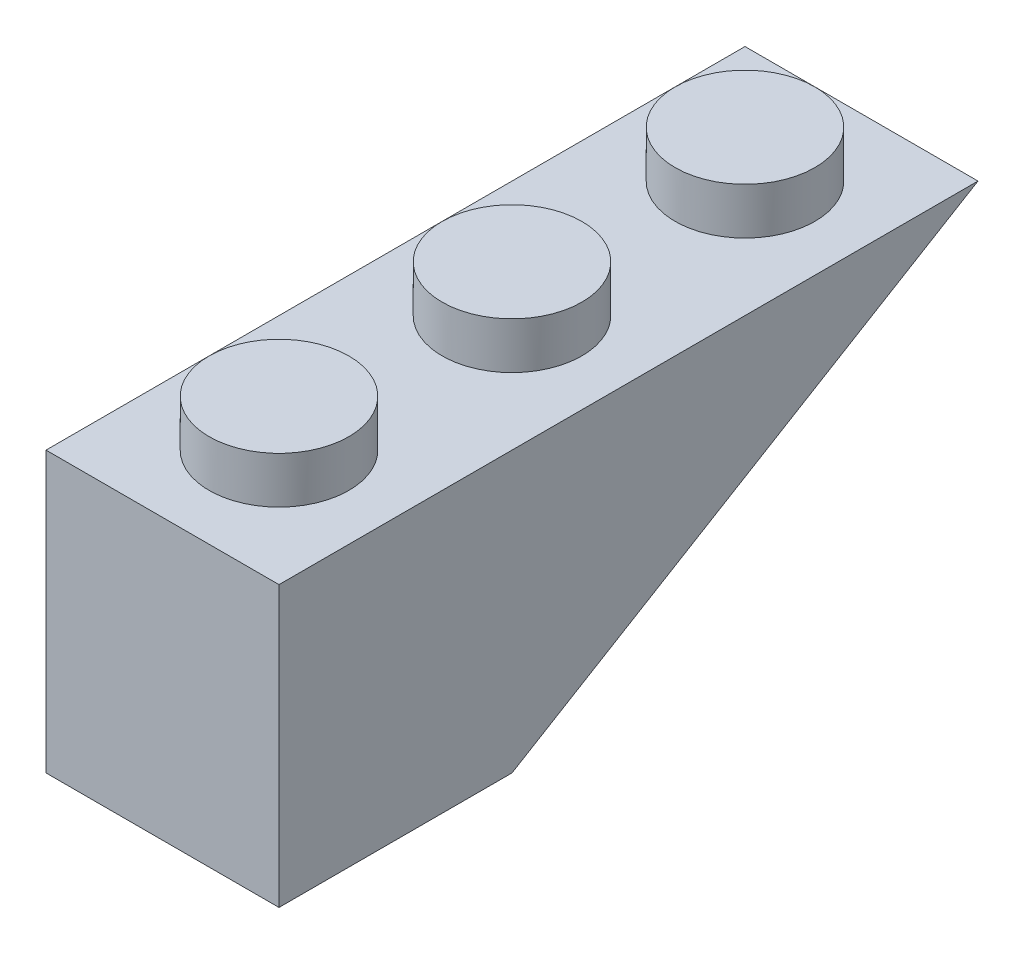
ISO-10303-21;
HEADER;
FILE_DESCRIPTION(('STEP AP214'),'2;1');
FILE_NAME('part.step','',(''),(''),'','','');
FILE_SCHEMA(('AUTOMOTIVE_DESIGN { 1 0 10303 214 1 1 1 1 }'));
ENDSEC;
DATA;
#1=APPLICATION_CONTEXT('core data for automotive mechanical design processes');
#2=APPLICATION_PROTOCOL_DEFINITION('international standard','automotive_design',2000,#1);
#3=PRODUCT_CONTEXT('',#1,'mechanical');
#4=PRODUCT('Part','Part','',(#3));
#5=PRODUCT_RELATED_PRODUCT_CATEGORY('part','',(#4));
#6=PRODUCT_DEFINITION_FORMATION('','',#4);
#7=PRODUCT_DEFINITION_CONTEXT('part definition',#1,'design');
#8=PRODUCT_DEFINITION('design','',#6,#7);
#9=PRODUCT_DEFINITION_SHAPE('','',#8);
#10=(LENGTH_UNIT() NAMED_UNIT(*) SI_UNIT(.MILLI.,.METRE.));
#11=(NAMED_UNIT(*) PLANE_ANGLE_UNIT() SI_UNIT($,.RADIAN.));
#12=(NAMED_UNIT(*) SI_UNIT($,.STERADIAN.) SOLID_ANGLE_UNIT());
#13=UNCERTAINTY_MEASURE_WITH_UNIT(LENGTH_MEASURE(1.E-05),#10,'distance_accuracy_value','');
#14=(GEOMETRIC_REPRESENTATION_CONTEXT(3) GLOBAL_UNCERTAINTY_ASSIGNED_CONTEXT((#13)) GLOBAL_UNIT_ASSIGNED_CONTEXT((#10,
#11,#12)) REPRESENTATION_CONTEXT('',''));
#15=CARTESIAN_POINT('',(0.,0.,0.));
#16=DIRECTION('',(0.,0.,1.));
#17=DIRECTION('',(1.,0.,0.));
#18=AXIS2_PLACEMENT_3D('',#15,#16,#17);
#19=CARTESIAN_POINT('',(8.,0.,0.));
#20=DIRECTION('',(0.,1.,0.));
#21=DIRECTION('',(0.,0.,1.));
#22=AXIS2_PLACEMENT_3D('',#19,#20,#21);
#23=PLANE('',#22);
#24=DIRECTION('',(0.,0.,-1.));
#25=VECTOR('',#24,1.);
#26=CARTESIAN_POINT('',(0.,0.,0.));
#27=LINE('',#26,#25);
#28=CARTESIAN_POINT('',(0.,0.,0.));
#29=VERTEX_POINT('',#28);
#30=CARTESIAN_POINT('',(0.,0.,-8.));
#31=VERTEX_POINT('',#30);
#32=EDGE_CURVE('E187',#29,#31,#27,.T.);
#33=ORIENTED_EDGE('',*,*,#32,.T.);
#34=DIRECTION('',(-1.,0.,0.));
#35=VECTOR('',#34,1.);
#36=CARTESIAN_POINT('',(8.,0.,-8.));
#37=LINE('',#36,#35);
#38=CARTESIAN_POINT('',(8.,0.,-8.));
#39=VERTEX_POINT('',#38);
#40=EDGE_CURVE('E194',#39,#31,#37,.T.);
#41=ORIENTED_EDGE('',*,*,#40,.F.);
#42=DIRECTION('',(0.,0.,-1.));
#43=VECTOR('',#42,1.);
#44=CARTESIAN_POINT('',(8.,0.,0.));
#45=LINE('',#44,#43);
#46=CARTESIAN_POINT('',(8.,0.,0.));
#47=VERTEX_POINT('',#46);
#48=EDGE_CURVE('E89',#47,#39,#45,.T.);
#49=ORIENTED_EDGE('',*,*,#48,.F.);
#50=DIRECTION('',(-1.,0.,0.));
#51=VECTOR('',#50,1.);
#52=CARTESIAN_POINT('',(8.,0.,0.));
#53=LINE('',#52,#51);
#54=EDGE_CURVE('E197',#47,#29,#53,.T.);
#55=ORIENTED_EDGE('',*,*,#54,.T.);
#56=EDGE_LOOP('',(#33,#41,#49,#55));
#57=FACE_BOUND('',#56,.T.);
#58=DIRECTION('',(0.,0.,-1.));
#59=VECTOR('',#58,1.);
#60=CARTESIAN_POINT('',(1.6,0.,0.));
#61=LINE('',#60,#59);
#62=CARTESIAN_POINT('',(1.6,0.,-1.6));
#63=VERTEX_POINT('',#62);
#64=CARTESIAN_POINT('',(1.6,0.,-6.4));
#65=VERTEX_POINT('',#64);
#66=EDGE_CURVE('E139',#63,#65,#61,.T.);
#67=ORIENTED_EDGE('',*,*,#66,.F.);
#68=DIRECTION('',(-1.,0.,0.));
#69=VECTOR('',#68,1.);
#70=CARTESIAN_POINT('',(8.,0.,-1.6));
#71=LINE('',#70,#69);
#72=CARTESIAN_POINT('',(6.4,0.,-1.6));
#73=VERTEX_POINT('',#72);
#74=EDGE_CURVE('E167',#73,#63,#71,.T.);
#75=ORIENTED_EDGE('',*,*,#74,.F.);
#76=DIRECTION('',(0.,0.,-1.));
#77=VECTOR('',#76,1.);
#78=CARTESIAN_POINT('',(6.4,0.,0.));
#79=LINE('',#78,#77);
#80=CARTESIAN_POINT('',(6.4,0.,-6.4));
#81=VERTEX_POINT('',#80);
#82=EDGE_CURVE('E145',#73,#81,#79,.T.);
#83=ORIENTED_EDGE('',*,*,#82,.T.);
#84=DIRECTION('',(-1.,0.,0.));
#85=VECTOR('',#84,1.);
#86=CARTESIAN_POINT('',(8.,0.,-6.4));
#87=LINE('',#86,#85);
#88=EDGE_CURVE('E162',#81,#65,#87,.T.);
#89=ORIENTED_EDGE('',*,*,#88,.T.);
#90=EDGE_LOOP('',(#67,#75,#83,#89));
#91=FACE_BOUND('',#90,.T.);
#92=ADVANCED_FACE('F43',(#57,#91),#23,.F.);
#93=CARTESIAN_POINT('',(8.,9.6,0.));
#94=DIRECTION('',(0.,0.,-1.));
#95=DIRECTION('',(0.,1.,0.));
#96=AXIS2_PLACEMENT_3D('',#93,#94,#95);
#97=PLANE('',#96);
#98=DIRECTION('',(0.,-1.,0.));
#99=VECTOR('',#98,1.);
#100=CARTESIAN_POINT('',(0.,9.6,0.));
#101=LINE('',#100,#99);
#102=CARTESIAN_POINT('',(0.,9.6,0.));
#103=VERTEX_POINT('',#102);
#104=EDGE_CURVE('E170',#103,#29,#101,.T.);
#105=ORIENTED_EDGE('',*,*,#104,.T.);
#106=ORIENTED_EDGE('',*,*,#54,.F.);
#107=DIRECTION('',(0.,-1.,0.));
#108=VECTOR('',#107,1.);
#109=CARTESIAN_POINT('',(8.,9.6,0.));
#110=LINE('',#109,#108);
#111=CARTESIAN_POINT('',(8.,9.6,0.));
#112=VERTEX_POINT('',#111);
#113=EDGE_CURVE('E179',#112,#47,#110,.T.);
#114=ORIENTED_EDGE('',*,*,#113,.F.);
#115=DIRECTION('',(-1.,0.,0.));
#116=VECTOR('',#115,1.);
#117=CARTESIAN_POINT('',(8.,9.6,0.));
#118=LINE('',#117,#116);
#119=EDGE_CURVE('E119',#112,#103,#118,.T.);
#120=ORIENTED_EDGE('',*,*,#119,.T.);
#121=EDGE_LOOP('',(#105,#106,#114,#120));
#122=FACE_BOUND('',#121,.T.);
#123=ADVANCED_FACE('F45',(#122),#97,.F.);
#124=CARTESIAN_POINT('',(8.,9.6,0.));
#125=DIRECTION('',(0.,-1.,0.));
#126=DIRECTION('',(0.,0.,-1.));
#127=AXIS2_PLACEMENT_3D('',#124,#125,#126);
#128=PLANE('',#127);
#129=CARTESIAN_POINT('',(4.,9.6,-20.));
#130=DIRECTION('',(0.,-1.,0.));
#131=DIRECTION('',(0.,0.,-1.));
#132=AXIS2_PLACEMENT_3D('',#129,#130,#131);
#133=CIRCLE('',#132,2.4);
#134=CARTESIAN_POINT('',(4.,9.6,-22.4));
#135=VERTEX_POINT('',#134);
#136=EDGE_CURVE('E11',#135,#135,#133,.F.);
#137=ORIENTED_EDGE('',*,*,#136,.F.);
#138=EDGE_LOOP('',(#137));
#139=FACE_BOUND('',#138,.T.);
#140=CARTESIAN_POINT('',(4.,9.6,-12.));
#141=DIRECTION('',(0.,-1.,0.));
#142=DIRECTION('',(0.,0.,-1.));
#143=AXIS2_PLACEMENT_3D('',#140,#141,#142);
#144=CIRCLE('',#143,2.4);
#145=CARTESIAN_POINT('',(4.,9.6,-14.4));
#146=VERTEX_POINT('',#145);
#147=EDGE_CURVE('E52',#146,#146,#144,.F.);
#148=ORIENTED_EDGE('',*,*,#147,.F.);
#149=EDGE_LOOP('',(#148));
#150=FACE_BOUND('',#149,.T.);
#151=CARTESIAN_POINT('',(4.,9.6,-4.));
#152=DIRECTION('',(0.,-1.,0.));
#153=DIRECTION('',(0.,0.,-1.));
#154=AXIS2_PLACEMENT_3D('',#151,#152,#153);
#155=CIRCLE('',#154,2.4);
#156=CARTESIAN_POINT('',(4.,9.6,-6.4));
#157=VERTEX_POINT('',#156);
#158=EDGE_CURVE('E200',#157,#157,#155,.F.);
#159=ORIENTED_EDGE('',*,*,#158,.F.);
#160=EDGE_LOOP('',(#159));
#161=FACE_BOUND('',#160,.T.);
#162=DIRECTION('',(0.,0.,1.));
#163=VECTOR('',#162,1.);
#164=CARTESIAN_POINT('',(0.,9.6,0.));
#165=LINE('',#164,#163);
#166=CARTESIAN_POINT('',(0.,9.6,-24.));
#167=VERTEX_POINT('',#166);
#168=EDGE_CURVE('E83',#167,#103,#165,.T.);
#169=ORIENTED_EDGE('',*,*,#168,.T.);
#170=ORIENTED_EDGE('',*,*,#119,.F.);
#171=DIRECTION('',(0.,0.,1.));
#172=VECTOR('',#171,1.);
#173=CARTESIAN_POINT('',(8.,9.6,0.));
#174=LINE('',#173,#172);
#175=CARTESIAN_POINT('',(8.,9.6,-24.));
#176=VERTEX_POINT('',#175);
#177=EDGE_CURVE('E68',#176,#112,#174,.T.);
#178=ORIENTED_EDGE('',*,*,#177,.F.);
#179=DIRECTION('',(-1.,0.,0.));
#180=VECTOR('',#179,1.);
#181=CARTESIAN_POINT('',(8.,9.6,-24.));
#182=LINE('',#181,#180);
#183=EDGE_CURVE('E118',#176,#167,#182,.T.);
#184=ORIENTED_EDGE('',*,*,#183,.T.);
#185=EDGE_LOOP('',(#169,#170,#178,#184));
#186=FACE_BOUND('',#185,.T.);
#187=ADVANCED_FACE('F116',(#139,#150,#161,#186),#128,.F.);
#188=CARTESIAN_POINT('',(8.,0.,0.));
#189=DIRECTION('',(1.,0.,0.));
#190=DIRECTION('',(0.,0.,-1.));
#191=AXIS2_PLACEMENT_3D('',#188,#189,#190);
#192=PLANE('',#191);
#193=ORIENTED_EDGE('',*,*,#113,.T.);
#194=ORIENTED_EDGE('',*,*,#48,.T.);
#195=DIRECTION('',(0.,0.514495755427527,-0.857492925712544));
#196=VECTOR('',#195,1.);
#197=CARTESIAN_POINT('',(8.,0.,-8.));
#198=LINE('',#197,#196);
#199=EDGE_CURVE('E124',#39,#176,#198,.T.);
#200=ORIENTED_EDGE('',*,*,#199,.T.);
#201=ORIENTED_EDGE('',*,*,#177,.T.);
#202=EDGE_LOOP('',(#193,#194,#200,#201));
#203=FACE_BOUND('',#202,.T.);
#204=ADVANCED_FACE('F125',(#203),#192,.T.);
#205=CARTESIAN_POINT('',(0.,0.,0.));
#206=DIRECTION('',(1.,0.,0.));
#207=DIRECTION('',(0.,0.,-1.));
#208=AXIS2_PLACEMENT_3D('',#205,#206,#207);
#209=PLANE('',#208);
#210=ORIENTED_EDGE('',*,*,#104,.F.);
#211=ORIENTED_EDGE('',*,*,#168,.F.);
#212=DIRECTION('',(0.,0.514495755427527,-0.857492925712544));
#213=VECTOR('',#212,1.);
#214=CARTESIAN_POINT('',(0.,0.,-8.));
#215=LINE('',#214,#213);
#216=EDGE_CURVE('E129',#31,#167,#215,.T.);
#217=ORIENTED_EDGE('',*,*,#216,.F.);
#218=ORIENTED_EDGE('',*,*,#32,.F.);
#219=EDGE_LOOP('',(#210,#211,#217,#218));
#220=FACE_BOUND('',#219,.T.);
#221=ADVANCED_FACE('F236',(#220),#209,.F.);
#222=CARTESIAN_POINT('',(8.,9.6,-1.6));
#223=DIRECTION('',(0.,0.,-1.));
#224=DIRECTION('',(0.,1.,0.));
#225=AXIS2_PLACEMENT_3D('',#222,#223,#224);
#226=PLANE('',#225);
#227=DIRECTION('',(0.,-1.,0.));
#228=VECTOR('',#227,1.);
#229=CARTESIAN_POINT('',(1.6,9.6,-1.6));
#230=LINE('',#229,#228);
#231=CARTESIAN_POINT('',(1.6,8.,-1.6));
#232=VERTEX_POINT('',#231);
#233=EDGE_CURVE('E135',#232,#63,#230,.T.);
#234=ORIENTED_EDGE('',*,*,#233,.F.);
#235=DIRECTION('',(-1.,0.,0.));
#236=VECTOR('',#235,1.);
#237=CARTESIAN_POINT('',(8.,8.,-1.6));
#238=LINE('',#237,#236);
#239=CARTESIAN_POINT('',(6.4,8.,-1.6));
#240=VERTEX_POINT('',#239);
#241=EDGE_CURVE('E147',#240,#232,#238,.T.);
#242=ORIENTED_EDGE('',*,*,#241,.F.);
#243=DIRECTION('',(0.,-1.,0.));
#244=VECTOR('',#243,1.);
#245=CARTESIAN_POINT('',(6.4,9.6,-1.6));
#246=LINE('',#245,#244);
#247=EDGE_CURVE('E59',#240,#73,#246,.T.);
#248=ORIENTED_EDGE('',*,*,#247,.T.);
#249=ORIENTED_EDGE('',*,*,#74,.T.);
#250=EDGE_LOOP('',(#234,#242,#248,#249));
#251=FACE_BOUND('',#250,.T.);
#252=ADVANCED_FACE('F239',(#251),#226,.T.);
#253=CARTESIAN_POINT('',(8.,9.6,-6.4));
#254=DIRECTION('',(0.,0.,1.));
#255=DIRECTION('',(1.,0.,0.));
#256=AXIS2_PLACEMENT_3D('',#253,#254,#255);
#257=PLANE('',#256);
#258=DIRECTION('',(0.,1.,0.));
#259=VECTOR('',#258,1.);
#260=CARTESIAN_POINT('',(1.6,9.6,-6.4));
#261=LINE('',#260,#259);
#262=CARTESIAN_POINT('',(1.6,8.,-6.4));
#263=VERTEX_POINT('',#262);
#264=EDGE_CURVE('E155',#65,#263,#261,.T.);
#265=ORIENTED_EDGE('',*,*,#264,.F.);
#266=ORIENTED_EDGE('',*,*,#88,.F.);
#267=DIRECTION('',(0.,1.,0.));
#268=VECTOR('',#267,1.);
#269=CARTESIAN_POINT('',(6.4,9.6,-6.4));
#270=LINE('',#269,#268);
#271=CARTESIAN_POINT('',(6.4,8.,-6.4));
#272=VERTEX_POINT('',#271);
#273=EDGE_CURVE('E158',#81,#272,#270,.T.);
#274=ORIENTED_EDGE('',*,*,#273,.T.);
#275=DIRECTION('',(-1.,0.,0.));
#276=VECTOR('',#275,1.);
#277=CARTESIAN_POINT('',(8.,8.,-6.4));
#278=LINE('',#277,#276);
#279=EDGE_CURVE('E151',#272,#263,#278,.T.);
#280=ORIENTED_EDGE('',*,*,#279,.T.);
#281=EDGE_LOOP('',(#265,#266,#274,#280));
#282=FACE_BOUND('',#281,.T.);
#283=ADVANCED_FACE('F253',(#282),#257,.T.);
#284=CARTESIAN_POINT('',(8.,8.,0.));
#285=DIRECTION('',(0.,-1.,0.));
#286=DIRECTION('',(0.,0.,-1.));
#287=AXIS2_PLACEMENT_3D('',#284,#285,#286);
#288=PLANE('',#287);
#289=DIRECTION('',(0.,0.,1.));
#290=VECTOR('',#289,1.);
#291=CARTESIAN_POINT('',(1.6,8.,0.));
#292=LINE('',#291,#290);
#293=EDGE_CURVE('E146',#263,#232,#292,.T.);
#294=ORIENTED_EDGE('',*,*,#293,.F.);
#295=ORIENTED_EDGE('',*,*,#279,.F.);
#296=DIRECTION('',(0.,0.,1.));
#297=VECTOR('',#296,1.);
#298=CARTESIAN_POINT('',(6.4,8.,0.));
#299=LINE('',#298,#297);
#300=EDGE_CURVE('E152',#272,#240,#299,.T.);
#301=ORIENTED_EDGE('',*,*,#300,.T.);
#302=ORIENTED_EDGE('',*,*,#241,.T.);
#303=EDGE_LOOP('',(#294,#295,#301,#302));
#304=FACE_BOUND('',#303,.T.);
#305=ADVANCED_FACE('F249',(#304),#288,.T.);
#306=CARTESIAN_POINT('',(6.4,0.,0.));
#307=DIRECTION('',(1.,0.,0.));
#308=DIRECTION('',(0.,0.,-1.));
#309=AXIS2_PLACEMENT_3D('',#306,#307,#308);
#310=PLANE('',#309);
#311=ORIENTED_EDGE('',*,*,#247,.F.);
#312=ORIENTED_EDGE('',*,*,#300,.F.);
#313=ORIENTED_EDGE('',*,*,#273,.F.);
#314=ORIENTED_EDGE('',*,*,#82,.F.);
#315=EDGE_LOOP('',(#311,#312,#313,#314));
#316=FACE_BOUND('',#315,.T.);
#317=ADVANCED_FACE('F245',(#316),#310,.F.);
#318=CARTESIAN_POINT('',(1.6,0.,0.));
#319=DIRECTION('',(1.,0.,0.));
#320=DIRECTION('',(0.,0.,-1.));
#321=AXIS2_PLACEMENT_3D('',#318,#319,#320);
#322=PLANE('',#321);
#323=ORIENTED_EDGE('',*,*,#233,.T.);
#324=ORIENTED_EDGE('',*,*,#66,.T.);
#325=ORIENTED_EDGE('',*,*,#264,.T.);
#326=ORIENTED_EDGE('',*,*,#293,.T.);
#327=EDGE_LOOP('',(#323,#324,#325,#326));
#328=FACE_BOUND('',#327,.T.);
#329=ADVANCED_FACE('F226',(#328),#322,.T.);
#330=CARTESIAN_POINT('',(8.,0.,-8.));
#331=DIRECTION('',(0.,0.857492925712544,0.514495755427527));
#332=DIRECTION('',(0.,-0.514495755427527,0.857492925712544));
#333=AXIS2_PLACEMENT_3D('',#330,#331,#332);
#334=PLANE('',#333);
#335=ORIENTED_EDGE('',*,*,#216,.T.);
#336=ORIENTED_EDGE('',*,*,#183,.F.);
#337=ORIENTED_EDGE('',*,*,#199,.F.);
#338=ORIENTED_EDGE('',*,*,#40,.T.);
#339=EDGE_LOOP('',(#335,#336,#337,#338));
#340=FACE_BOUND('',#339,.T.);
#341=ADVANCED_FACE('F132',(#340),#334,.F.);
#342=CARTESIAN_POINT('',(4.,11.2,-4.));
#343=DIRECTION('',(0.,-1.,0.));
#344=DIRECTION('',(0.,0.,-1.));
#345=AXIS2_PLACEMENT_3D('',#342,#343,#344);
#346=CYLINDRICAL_SURFACE('',#345,2.4);
#347=CARTESIAN_POINT('',(4.,11.2,-4.));
#348=DIRECTION('',(0.,1.,0.));
#349=DIRECTION('',(0.,0.,1.));
#350=AXIS2_PLACEMENT_3D('',#347,#348,#349);
#351=CIRCLE('',#350,2.4);
#352=CARTESIAN_POINT('',(4.,11.2,-1.6));
#353=VERTEX_POINT('',#352);
#354=EDGE_CURVE('E361',#353,#353,#351,.T.);
#355=ORIENTED_EDGE('',*,*,#354,.F.);
#356=EDGE_LOOP('',(#355));
#357=FACE_BOUND('',#356,.T.);
#358=ORIENTED_EDGE('',*,*,#158,.T.);
#359=EDGE_LOOP('',(#358));
#360=FACE_BOUND('',#359,.T.);
#361=ADVANCED_FACE('F215',(#357,#360),#346,.T.);
#362=CARTESIAN_POINT('',(4.,11.2,-4.));
#363=DIRECTION('',(0.,1.,0.));
#364=DIRECTION('',(0.,0.,1.));
#365=AXIS2_PLACEMENT_3D('',#362,#363,#364);
#366=PLANE('',#365);
#367=ORIENTED_EDGE('',*,*,#354,.T.);
#368=EDGE_LOOP('',(#367));
#369=FACE_BOUND('',#368,.T.);
#370=ADVANCED_FACE('F217',(#369),#366,.T.);
#371=CARTESIAN_POINT('',(4.,11.2,-12.));
#372=DIRECTION('',(0.,-1.,0.));
#373=DIRECTION('',(0.,0.,-1.));
#374=AXIS2_PLACEMENT_3D('',#371,#372,#373);
#375=CYLINDRICAL_SURFACE('',#374,2.4);
#376=CARTESIAN_POINT('',(4.,11.2,-12.));
#377=DIRECTION('',(0.,1.,0.));
#378=DIRECTION('',(0.,0.,1.));
#379=AXIS2_PLACEMENT_3D('',#376,#377,#378);
#380=CIRCLE('',#379,2.4);
#381=CARTESIAN_POINT('',(4.,11.2,-9.6));
#382=VERTEX_POINT('',#381);
#383=EDGE_CURVE('E357',#382,#382,#380,.T.);
#384=ORIENTED_EDGE('',*,*,#383,.F.);
#385=EDGE_LOOP('',(#384));
#386=FACE_BOUND('',#385,.T.);
#387=ORIENTED_EDGE('',*,*,#147,.T.);
#388=EDGE_LOOP('',(#387));
#389=FACE_BOUND('',#388,.T.);
#390=ADVANCED_FACE('F207',(#386,#389),#375,.T.);
#391=CARTESIAN_POINT('',(4.,11.2,-12.));
#392=DIRECTION('',(0.,1.,0.));
#393=DIRECTION('',(0.,0.,1.));
#394=AXIS2_PLACEMENT_3D('',#391,#392,#393);
#395=PLANE('',#394);
#396=ORIENTED_EDGE('',*,*,#383,.T.);
#397=EDGE_LOOP('',(#396));
#398=FACE_BOUND('',#397,.T.);
#399=ADVANCED_FACE('F319',(#398),#395,.T.);
#400=CARTESIAN_POINT('',(4.,11.2,-20.));
#401=DIRECTION('',(0.,-1.,0.));
#402=DIRECTION('',(0.,0.,-1.));
#403=AXIS2_PLACEMENT_3D('',#400,#401,#402);
#404=CYLINDRICAL_SURFACE('',#403,2.4);
#405=CARTESIAN_POINT('',(4.,11.2,-20.));
#406=DIRECTION('',(0.,1.,0.));
#407=DIRECTION('',(0.,0.,1.));
#408=AXIS2_PLACEMENT_3D('',#405,#406,#407);
#409=CIRCLE('',#408,2.4);
#410=CARTESIAN_POINT('',(4.,11.2,-17.6));
#411=VERTEX_POINT('',#410);
#412=EDGE_CURVE('E355',#411,#411,#409,.T.);
#413=ORIENTED_EDGE('',*,*,#412,.F.);
#414=EDGE_LOOP('',(#413));
#415=FACE_BOUND('',#414,.T.);
#416=ORIENTED_EDGE('',*,*,#136,.T.);
#417=EDGE_LOOP('',(#416));
#418=FACE_BOUND('',#417,.T.);
#419=ADVANCED_FACE('F329',(#415,#418),#404,.T.);
#420=CARTESIAN_POINT('',(4.,11.2,-20.));
#421=DIRECTION('',(0.,1.,0.));
#422=DIRECTION('',(0.,0.,1.));
#423=AXIS2_PLACEMENT_3D('',#420,#421,#422);
#424=PLANE('',#423);
#425=ORIENTED_EDGE('',*,*,#412,.T.);
#426=EDGE_LOOP('',(#425));
#427=FACE_BOUND('',#426,.T.);
#428=ADVANCED_FACE('F339',(#427),#424,.T.);
#429=CLOSED_SHELL('',(#92,#123,#187,#204,#221,#252,#283,#305,#317,#329,#341,#361,#370,#390,#399,
#419,#428));
#430=MANIFOLD_SOLID_BREP('B2',#429);
#431=ADVANCED_BREP_SHAPE_REPRESENTATION('',(#18,#430),#14);
#432=SHAPE_DEFINITION_REPRESENTATION(#9,#431);
ENDSEC;
END-ISO-10303-21;
